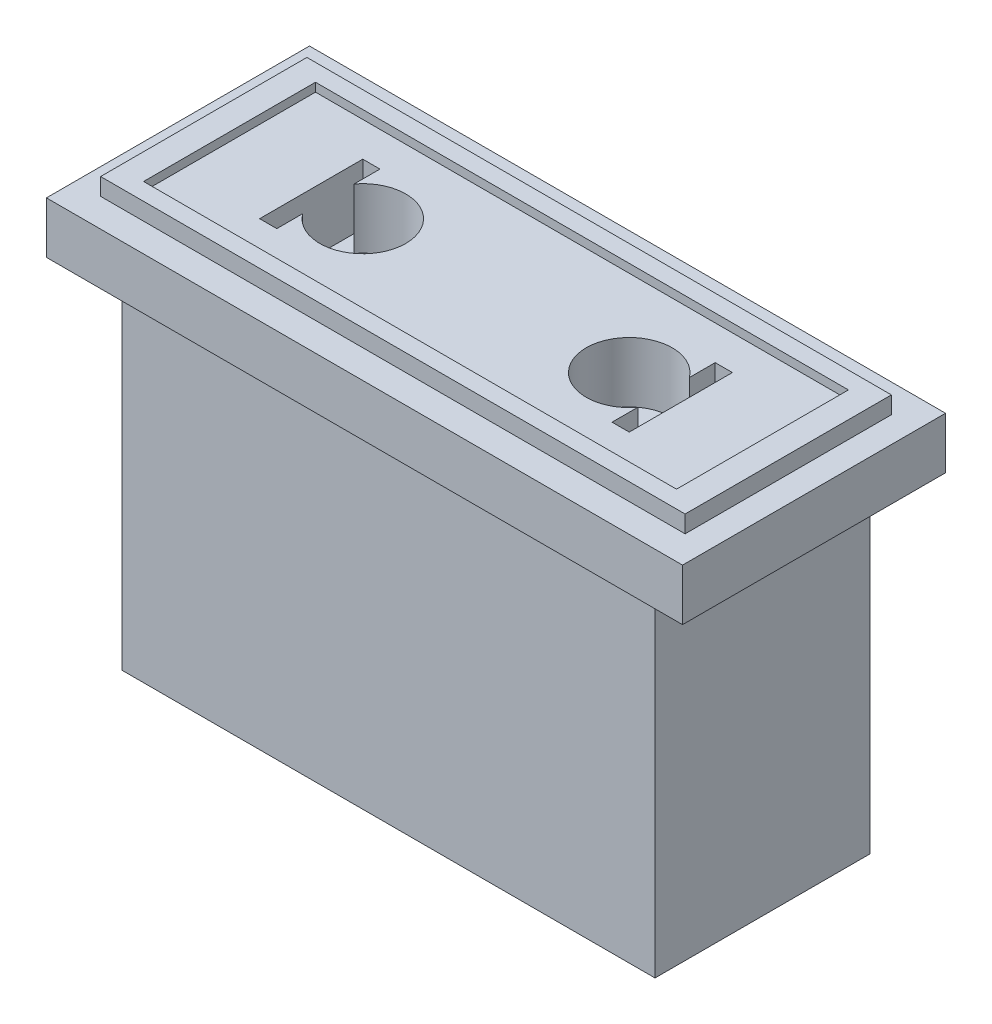
ISO-10303-21;
HEADER;
FILE_DESCRIPTION(('STEP AP214'),'2;1');
FILE_NAME('part.step','',(''),(''),'','','');
FILE_SCHEMA(('AUTOMOTIVE_DESIGN { 1 0 10303 214 1 1 1 1 }'));
ENDSEC;
DATA;
#1=APPLICATION_CONTEXT('core data for automotive mechanical design processes');
#2=APPLICATION_PROTOCOL_DEFINITION('international standard','automotive_design',2000,#1);
#3=PRODUCT_CONTEXT('',#1,'mechanical');
#4=PRODUCT('Part','Part','',(#3));
#5=PRODUCT_RELATED_PRODUCT_CATEGORY('part','',(#4));
#6=PRODUCT_DEFINITION_FORMATION('','',#4);
#7=PRODUCT_DEFINITION_CONTEXT('part definition',#1,'design');
#8=PRODUCT_DEFINITION('design','',#6,#7);
#9=PRODUCT_DEFINITION_SHAPE('','',#8);
#10=(LENGTH_UNIT() NAMED_UNIT(*) SI_UNIT(.MILLI.,.METRE.));
#11=(NAMED_UNIT(*) PLANE_ANGLE_UNIT() SI_UNIT($,.RADIAN.));
#12=(NAMED_UNIT(*) SI_UNIT($,.STERADIAN.) SOLID_ANGLE_UNIT());
#13=UNCERTAINTY_MEASURE_WITH_UNIT(LENGTH_MEASURE(1.E-05),#10,'distance_accuracy_value','');
#14=(GEOMETRIC_REPRESENTATION_CONTEXT(3) GLOBAL_UNCERTAINTY_ASSIGNED_CONTEXT((#13)) GLOBAL_UNIT_ASSIGNED_CONTEXT((#10,
#11,#12)) REPRESENTATION_CONTEXT('',''));
#15=CARTESIAN_POINT('',(0.,0.,0.));
#16=DIRECTION('',(0.,0.,1.));
#17=DIRECTION('',(1.,0.,0.));
#18=AXIS2_PLACEMENT_3D('',#15,#16,#17);
#19=CARTESIAN_POINT('',(0.,0.,0.));
#20=DIRECTION('',(0.,1.,0.));
#21=DIRECTION('',(0.,0.,1.));
#22=AXIS2_PLACEMENT_3D('',#19,#20,#21);
#23=PLANE('',#22);
#24=DIRECTION('',(0.,0.,1.));
#25=VECTOR('',#24,1.);
#26=CARTESIAN_POINT('',(-18.5,0.,7.65));
#27=LINE('',#26,#25);
#28=CARTESIAN_POINT('',(-18.5,0.,-7.65));
#29=VERTEX_POINT('',#28);
#30=CARTESIAN_POINT('',(-18.5,0.,7.65));
#31=VERTEX_POINT('',#30);
#32=EDGE_CURVE('E475',#29,#31,#27,.T.);
#33=ORIENTED_EDGE('',*,*,#32,.F.);
#34=DIRECTION('',(-1.,0.,0.));
#35=VECTOR('',#34,1.);
#36=CARTESIAN_POINT('',(18.5,0.,-7.65));
#37=LINE('',#36,#35);
#38=CARTESIAN_POINT('',(18.5,0.,-7.65));
#39=VERTEX_POINT('',#38);
#40=EDGE_CURVE('E481',#39,#29,#37,.T.);
#41=ORIENTED_EDGE('',*,*,#40,.F.);
#42=DIRECTION('',(0.,0.,-1.));
#43=VECTOR('',#42,1.);
#44=CARTESIAN_POINT('',(18.5,0.,7.65));
#45=LINE('',#44,#43);
#46=CARTESIAN_POINT('',(18.5,0.,7.65));
#47=VERTEX_POINT('',#46);
#48=EDGE_CURVE('E497',#47,#39,#45,.T.);
#49=ORIENTED_EDGE('',*,*,#48,.F.);
#50=DIRECTION('',(1.,0.,0.));
#51=VECTOR('',#50,1.);
#52=CARTESIAN_POINT('',(18.5,0.,7.65));
#53=LINE('',#52,#51);
#54=EDGE_CURVE('E494',#31,#47,#53,.T.);
#55=ORIENTED_EDGE('',*,*,#54,.F.);
#56=EDGE_LOOP('',(#33,#41,#49,#55));
#57=FACE_BOUND('',#56,.T.);
#58=DIRECTION('',(0.,0.,-1.));
#59=VECTOR('',#58,1.);
#60=CARTESIAN_POINT('',(-15.5,0.,-6.25));
#61=LINE('',#60,#59);
#62=CARTESIAN_POINT('',(-15.5,0.,6.25));
#63=VERTEX_POINT('',#62);
#64=CARTESIAN_POINT('',(-15.5,0.,-6.25));
#65=VERTEX_POINT('',#64);
#66=EDGE_CURVE('E55',#63,#65,#61,.T.);
#67=ORIENTED_EDGE('',*,*,#66,.F.);
#68=DIRECTION('',(-1.,0.,0.));
#69=VECTOR('',#68,1.);
#70=CARTESIAN_POINT('',(15.5,0.,6.25));
#71=LINE('',#70,#69);
#72=CARTESIAN_POINT('',(15.5,0.,6.25));
#73=VERTEX_POINT('',#72);
#74=EDGE_CURVE('E59',#73,#63,#71,.T.);
#75=ORIENTED_EDGE('',*,*,#74,.F.);
#76=DIRECTION('',(0.,0.,1.));
#77=VECTOR('',#76,1.);
#78=CARTESIAN_POINT('',(15.5,0.,-6.25));
#79=LINE('',#78,#77);
#80=CARTESIAN_POINT('',(15.5,0.,-6.25));
#81=VERTEX_POINT('',#80);
#82=EDGE_CURVE('E906',#81,#73,#79,.T.);
#83=ORIENTED_EDGE('',*,*,#82,.F.);
#84=DIRECTION('',(1.,0.,0.));
#85=VECTOR('',#84,1.);
#86=CARTESIAN_POINT('',(15.5,0.,-6.25));
#87=LINE('',#86,#85);
#88=EDGE_CURVE('E916',#65,#81,#87,.T.);
#89=ORIENTED_EDGE('',*,*,#88,.F.);
#90=EDGE_LOOP('',(#67,#75,#83,#89));
#91=FACE_BOUND('',#90,.T.);
#92=ADVANCED_FACE('F39',(#57,#91),#23,.F.);
#93=CARTESIAN_POINT('',(-18.5,3.,7.65));
#94=DIRECTION('',(1.,0.,0.));
#95=DIRECTION('',(0.,0.,-1.));
#96=AXIS2_PLACEMENT_3D('',#93,#94,#95);
#97=PLANE('',#96);
#98=ORIENTED_EDGE('',*,*,#32,.T.);
#99=DIRECTION('',(0.,-1.,0.));
#100=VECTOR('',#99,1.);
#101=CARTESIAN_POINT('',(-18.5,3.,7.65));
#102=LINE('',#101,#100);
#103=CARTESIAN_POINT('',(-18.5,3.,7.65));
#104=VERTEX_POINT('',#103);
#105=EDGE_CURVE('E11',#104,#31,#102,.T.);
#106=ORIENTED_EDGE('',*,*,#105,.F.);
#107=DIRECTION('',(0.,0.,1.));
#108=VECTOR('',#107,1.);
#109=CARTESIAN_POINT('',(-18.5,3.,7.65));
#110=LINE('',#109,#108);
#111=CARTESIAN_POINT('',(-18.5,3.,-7.65));
#112=VERTEX_POINT('',#111);
#113=EDGE_CURVE('E476',#112,#104,#110,.T.);
#114=ORIENTED_EDGE('',*,*,#113,.F.);
#115=DIRECTION('',(0.,-1.,0.));
#116=VECTOR('',#115,1.);
#117=CARTESIAN_POINT('',(-18.5,3.,-7.65));
#118=LINE('',#117,#116);
#119=EDGE_CURVE('E490',#112,#29,#118,.T.);
#120=ORIENTED_EDGE('',*,*,#119,.T.);
#121=EDGE_LOOP('',(#98,#106,#114,#120));
#122=FACE_BOUND('',#121,.T.);
#123=ADVANCED_FACE('F41',(#122),#97,.F.);
#124=CARTESIAN_POINT('',(18.5,3.,7.65));
#125=DIRECTION('',(0.,0.,-1.));
#126=DIRECTION('',(-1.,0.,0.));
#127=AXIS2_PLACEMENT_3D('',#124,#125,#126);
#128=PLANE('',#127);
#129=ORIENTED_EDGE('',*,*,#54,.T.);
#130=DIRECTION('',(0.,-1.,0.));
#131=VECTOR('',#130,1.);
#132=CARTESIAN_POINT('',(18.5,3.,7.65));
#133=LINE('',#132,#131);
#134=CARTESIAN_POINT('',(18.5,3.,7.65));
#135=VERTEX_POINT('',#134);
#136=EDGE_CURVE('E48',#135,#47,#133,.T.);
#137=ORIENTED_EDGE('',*,*,#136,.F.);
#138=DIRECTION('',(1.,0.,0.));
#139=VECTOR('',#138,1.);
#140=CARTESIAN_POINT('',(18.5,3.,7.65));
#141=LINE('',#140,#139);
#142=EDGE_CURVE('E480',#104,#135,#141,.T.);
#143=ORIENTED_EDGE('',*,*,#142,.F.);
#144=ORIENTED_EDGE('',*,*,#105,.T.);
#145=EDGE_LOOP('',(#129,#137,#143,#144));
#146=FACE_BOUND('',#145,.T.);
#147=ADVANCED_FACE('F529',(#146),#128,.F.);
#148=CARTESIAN_POINT('',(18.5,3.,7.65));
#149=DIRECTION('',(-1.,0.,0.));
#150=DIRECTION('',(0.,0.,1.));
#151=AXIS2_PLACEMENT_3D('',#148,#149,#150);
#152=PLANE('',#151);
#153=ORIENTED_EDGE('',*,*,#48,.T.);
#154=DIRECTION('',(0.,-1.,0.));
#155=VECTOR('',#154,1.);
#156=CARTESIAN_POINT('',(18.5,3.,-7.65));
#157=LINE('',#156,#155);
#158=CARTESIAN_POINT('',(18.5,3.,-7.65));
#159=VERTEX_POINT('',#158);
#160=EDGE_CURVE('E505',#159,#39,#157,.T.);
#161=ORIENTED_EDGE('',*,*,#160,.F.);
#162=DIRECTION('',(0.,0.,-1.));
#163=VECTOR('',#162,1.);
#164=CARTESIAN_POINT('',(18.5,3.,7.65));
#165=LINE('',#164,#163);
#166=EDGE_CURVE('E484',#135,#159,#165,.T.);
#167=ORIENTED_EDGE('',*,*,#166,.F.);
#168=ORIENTED_EDGE('',*,*,#136,.T.);
#169=EDGE_LOOP('',(#153,#161,#167,#168));
#170=FACE_BOUND('',#169,.T.);
#171=ADVANCED_FACE('F514',(#170),#152,.F.);
#172=CARTESIAN_POINT('',(18.5,3.,-7.65));
#173=DIRECTION('',(0.,0.,1.));
#174=DIRECTION('',(1.,0.,0.));
#175=AXIS2_PLACEMENT_3D('',#172,#173,#174);
#176=PLANE('',#175);
#177=ORIENTED_EDGE('',*,*,#40,.T.);
#178=ORIENTED_EDGE('',*,*,#119,.F.);
#179=DIRECTION('',(-1.,0.,0.));
#180=VECTOR('',#179,1.);
#181=CARTESIAN_POINT('',(18.5,3.,-7.65));
#182=LINE('',#181,#180);
#183=EDGE_CURVE('E487',#159,#112,#182,.T.);
#184=ORIENTED_EDGE('',*,*,#183,.F.);
#185=ORIENTED_EDGE('',*,*,#160,.T.);
#186=EDGE_LOOP('',(#177,#178,#184,#185));
#187=FACE_BOUND('',#186,.T.);
#188=ADVANCED_FACE('F522',(#187),#176,.F.);
#189=CARTESIAN_POINT('',(0.,3.,0.));
#190=DIRECTION('',(0.,1.,0.));
#191=DIRECTION('',(0.,0.,1.));
#192=AXIS2_PLACEMENT_3D('',#189,#190,#191);
#193=PLANE('',#192);
#194=DIRECTION('',(0.,0.,1.));
#195=VECTOR('',#194,1.);
#196=CARTESIAN_POINT('',(-17.,3.,6.));
#197=LINE('',#196,#195);
#198=CARTESIAN_POINT('',(-17.,3.,-6.));
#199=VERTEX_POINT('',#198);
#200=CARTESIAN_POINT('',(-17.,3.,6.));
#201=VERTEX_POINT('',#200);
#202=EDGE_CURVE('E421',#199,#201,#197,.T.);
#203=ORIENTED_EDGE('',*,*,#202,.F.);
#204=DIRECTION('',(-1.,0.,0.));
#205=VECTOR('',#204,1.);
#206=CARTESIAN_POINT('',(17.,3.,-6.));
#207=LINE('',#206,#205);
#208=CARTESIAN_POINT('',(17.,3.,-6.));
#209=VERTEX_POINT('',#208);
#210=EDGE_CURVE('E436',#209,#199,#207,.T.);
#211=ORIENTED_EDGE('',*,*,#210,.F.);
#212=DIRECTION('',(0.,0.,-1.));
#213=VECTOR('',#212,1.);
#214=CARTESIAN_POINT('',(17.,3.,6.));
#215=LINE('',#214,#213);
#216=CARTESIAN_POINT('',(17.,3.,6.));
#217=VERTEX_POINT('',#216);
#218=EDGE_CURVE('E453',#217,#209,#215,.T.);
#219=ORIENTED_EDGE('',*,*,#218,.F.);
#220=DIRECTION('',(1.,0.,0.));
#221=VECTOR('',#220,1.);
#222=CARTESIAN_POINT('',(17.,3.,6.));
#223=LINE('',#222,#221);
#224=EDGE_CURVE('E449',#201,#217,#223,.T.);
#225=ORIENTED_EDGE('',*,*,#224,.F.);
#226=EDGE_LOOP('',(#203,#211,#219,#225));
#227=FACE_BOUND('',#226,.T.);
#228=ORIENTED_EDGE('',*,*,#113,.T.);
#229=ORIENTED_EDGE('',*,*,#142,.T.);
#230=ORIENTED_EDGE('',*,*,#166,.T.);
#231=ORIENTED_EDGE('',*,*,#183,.T.);
#232=EDGE_LOOP('',(#228,#229,#230,#231));
#233=FACE_BOUND('',#232,.T.);
#234=ADVANCED_FACE('F528',(#227,#233),#193,.T.);
#235=CARTESIAN_POINT('',(-17.,4.,6.));
#236=DIRECTION('',(1.,0.,0.));
#237=DIRECTION('',(0.,0.,-1.));
#238=AXIS2_PLACEMENT_3D('',#235,#236,#237);
#239=PLANE('',#238);
#240=ORIENTED_EDGE('',*,*,#202,.T.);
#241=DIRECTION('',(0.,-1.,0.));
#242=VECTOR('',#241,1.);
#243=CARTESIAN_POINT('',(-17.,4.,6.));
#244=LINE('',#243,#242);
#245=CARTESIAN_POINT('',(-17.,4.,6.));
#246=VERTEX_POINT('',#245);
#247=EDGE_CURVE('E471',#246,#201,#244,.T.);
#248=ORIENTED_EDGE('',*,*,#247,.F.);
#249=DIRECTION('',(0.,0.,1.));
#250=VECTOR('',#249,1.);
#251=CARTESIAN_POINT('',(-17.,4.,6.));
#252=LINE('',#251,#250);
#253=CARTESIAN_POINT('',(-17.,4.,-6.));
#254=VERTEX_POINT('',#253);
#255=EDGE_CURVE('E431',#254,#246,#252,.T.);
#256=ORIENTED_EDGE('',*,*,#255,.F.);
#257=DIRECTION('',(0.,-1.,0.));
#258=VECTOR('',#257,1.);
#259=CARTESIAN_POINT('',(-17.,4.,-6.));
#260=LINE('',#259,#258);
#261=EDGE_CURVE('E445',#254,#199,#260,.T.);
#262=ORIENTED_EDGE('',*,*,#261,.T.);
#263=EDGE_LOOP('',(#240,#248,#256,#262));
#264=FACE_BOUND('',#263,.T.);
#265=ADVANCED_FACE('F547',(#264),#239,.F.);
#266=CARTESIAN_POINT('',(17.,4.,6.));
#267=DIRECTION('',(0.,0.,-1.));
#268=DIRECTION('',(-1.,0.,0.));
#269=AXIS2_PLACEMENT_3D('',#266,#267,#268);
#270=PLANE('',#269);
#271=ORIENTED_EDGE('',*,*,#224,.T.);
#272=DIRECTION('',(0.,-1.,0.));
#273=VECTOR('',#272,1.);
#274=CARTESIAN_POINT('',(17.,4.,6.));
#275=LINE('',#274,#273);
#276=CARTESIAN_POINT('',(17.,4.,6.));
#277=VERTEX_POINT('',#276);
#278=EDGE_CURVE('E467',#277,#217,#275,.T.);
#279=ORIENTED_EDGE('',*,*,#278,.F.);
#280=DIRECTION('',(1.,0.,0.));
#281=VECTOR('',#280,1.);
#282=CARTESIAN_POINT('',(17.,4.,6.));
#283=LINE('',#282,#281);
#284=EDGE_CURVE('E435',#246,#277,#283,.T.);
#285=ORIENTED_EDGE('',*,*,#284,.F.);
#286=ORIENTED_EDGE('',*,*,#247,.T.);
#287=EDGE_LOOP('',(#271,#279,#285,#286));
#288=FACE_BOUND('',#287,.T.);
#289=ADVANCED_FACE('F552',(#288),#270,.F.);
#290=CARTESIAN_POINT('',(17.,4.,6.));
#291=DIRECTION('',(-1.,0.,0.));
#292=DIRECTION('',(0.,0.,1.));
#293=AXIS2_PLACEMENT_3D('',#290,#291,#292);
#294=PLANE('',#293);
#295=ORIENTED_EDGE('',*,*,#218,.T.);
#296=DIRECTION('',(0.,-1.,0.));
#297=VECTOR('',#296,1.);
#298=CARTESIAN_POINT('',(17.,4.,-6.));
#299=LINE('',#298,#297);
#300=CARTESIAN_POINT('',(17.,4.,-6.));
#301=VERTEX_POINT('',#300);
#302=EDGE_CURVE('E463',#301,#209,#299,.T.);
#303=ORIENTED_EDGE('',*,*,#302,.F.);
#304=DIRECTION('',(0.,0.,-1.));
#305=VECTOR('',#304,1.);
#306=CARTESIAN_POINT('',(17.,4.,6.));
#307=LINE('',#306,#305);
#308=EDGE_CURVE('E439',#277,#301,#307,.T.);
#309=ORIENTED_EDGE('',*,*,#308,.F.);
#310=ORIENTED_EDGE('',*,*,#278,.T.);
#311=EDGE_LOOP('',(#295,#303,#309,#310));
#312=FACE_BOUND('',#311,.T.);
#313=ADVANCED_FACE('F566',(#312),#294,.F.);
#314=CARTESIAN_POINT('',(17.,4.,-6.));
#315=DIRECTION('',(0.,0.,1.));
#316=DIRECTION('',(1.,0.,0.));
#317=AXIS2_PLACEMENT_3D('',#314,#315,#316);
#318=PLANE('',#317);
#319=ORIENTED_EDGE('',*,*,#210,.T.);
#320=ORIENTED_EDGE('',*,*,#261,.F.);
#321=DIRECTION('',(-1.,0.,0.));
#322=VECTOR('',#321,1.);
#323=CARTESIAN_POINT('',(17.,4.,-6.));
#324=LINE('',#323,#322);
#325=EDGE_CURVE('E442',#301,#254,#324,.T.);
#326=ORIENTED_EDGE('',*,*,#325,.F.);
#327=ORIENTED_EDGE('',*,*,#302,.T.);
#328=EDGE_LOOP('',(#319,#320,#326,#327));
#329=FACE_BOUND('',#328,.T.);
#330=ADVANCED_FACE('F557',(#329),#318,.F.);
#331=CARTESIAN_POINT('',(0.,4.,0.));
#332=DIRECTION('',(0.,1.,0.));
#333=DIRECTION('',(0.,0.,1.));
#334=AXIS2_PLACEMENT_3D('',#331,#332,#333);
#335=PLANE('',#334);
#336=DIRECTION('',(0.,0.,1.));
#337=VECTOR('',#336,1.);
#338=CARTESIAN_POINT('',(-15.5,4.,5.));
#339=LINE('',#338,#337);
#340=CARTESIAN_POINT('',(-15.5,4.,-5.));
#341=VERTEX_POINT('',#340);
#342=CARTESIAN_POINT('',(-15.5,4.,5.));
#343=VERTEX_POINT('',#342);
#344=EDGE_CURVE('E386',#341,#343,#339,.T.);
#345=ORIENTED_EDGE('',*,*,#344,.F.);
#346=DIRECTION('',(-1.,0.,0.));
#347=VECTOR('',#346,1.);
#348=CARTESIAN_POINT('',(15.5,4.,-5.));
#349=LINE('',#348,#347);
#350=CARTESIAN_POINT('',(15.5,4.,-5.));
#351=VERTEX_POINT('',#350);
#352=EDGE_CURVE('E392',#351,#341,#349,.T.);
#353=ORIENTED_EDGE('',*,*,#352,.F.);
#354=DIRECTION('',(0.,0.,-1.));
#355=VECTOR('',#354,1.);
#356=CARTESIAN_POINT('',(15.5,4.,5.));
#357=LINE('',#356,#355);
#358=CARTESIAN_POINT('',(15.5,4.,5.));
#359=VERTEX_POINT('',#358);
#360=EDGE_CURVE('E411',#359,#351,#357,.T.);
#361=ORIENTED_EDGE('',*,*,#360,.F.);
#362=DIRECTION('',(1.,0.,0.));
#363=VECTOR('',#362,1.);
#364=CARTESIAN_POINT('',(15.5,4.,5.));
#365=LINE('',#364,#363);
#366=EDGE_CURVE('E407',#343,#359,#365,.T.);
#367=ORIENTED_EDGE('',*,*,#366,.F.);
#368=EDGE_LOOP('',(#345,#353,#361,#367));
#369=FACE_BOUND('',#368,.T.);
#370=ORIENTED_EDGE('',*,*,#255,.T.);
#371=ORIENTED_EDGE('',*,*,#284,.T.);
#372=ORIENTED_EDGE('',*,*,#308,.T.);
#373=ORIENTED_EDGE('',*,*,#325,.T.);
#374=EDGE_LOOP('',(#370,#371,#372,#373));
#375=FACE_BOUND('',#374,.T.);
#376=ADVANCED_FACE('F562',(#369,#375),#335,.T.);
#377=CARTESIAN_POINT('',(-15.5,3.5,5.));
#378=DIRECTION('',(-1.,0.,0.));
#379=DIRECTION('',(0.,0.,1.));
#380=AXIS2_PLACEMENT_3D('',#377,#378,#379);
#381=PLANE('',#380);
#382=ORIENTED_EDGE('',*,*,#344,.T.);
#383=DIRECTION('',(0.,1.,0.));
#384=VECTOR('',#383,1.);
#385=CARTESIAN_POINT('',(-15.5,3.5,5.));
#386=LINE('',#385,#384);
#387=CARTESIAN_POINT('',(-15.5,3.5,5.));
#388=VERTEX_POINT('',#387);
#389=EDGE_CURVE('E404',#388,#343,#386,.T.);
#390=ORIENTED_EDGE('',*,*,#389,.F.);
#391=DIRECTION('',(0.,0.,1.));
#392=VECTOR('',#391,1.);
#393=CARTESIAN_POINT('',(-15.5,3.5,5.));
#394=LINE('',#393,#392);
#395=CARTESIAN_POINT('',(-15.5,3.5,-5.));
#396=VERTEX_POINT('',#395);
#397=EDGE_CURVE('E387',#396,#388,#394,.T.);
#398=ORIENTED_EDGE('',*,*,#397,.F.);
#399=DIRECTION('',(0.,1.,0.));
#400=VECTOR('',#399,1.);
#401=CARTESIAN_POINT('',(-15.5,3.5,-5.));
#402=LINE('',#401,#400);
#403=EDGE_CURVE('E418',#396,#341,#402,.T.);
#404=ORIENTED_EDGE('',*,*,#403,.T.);
#405=EDGE_LOOP('',(#382,#390,#398,#404));
#406=FACE_BOUND('',#405,.T.);
#407=ADVANCED_FACE('F579',(#406),#381,.F.);
#408=CARTESIAN_POINT('',(15.5,3.5,-5.));
#409=DIRECTION('',(0.,0.,-1.));
#410=DIRECTION('',(-1.,0.,0.));
#411=AXIS2_PLACEMENT_3D('',#408,#409,#410);
#412=PLANE('',#411);
#413=ORIENTED_EDGE('',*,*,#352,.T.);
#414=ORIENTED_EDGE('',*,*,#403,.F.);
#415=DIRECTION('',(-1.,0.,0.));
#416=VECTOR('',#415,1.);
#417=CARTESIAN_POINT('',(15.5,3.5,-5.));
#418=LINE('',#417,#416);
#419=CARTESIAN_POINT('',(15.5,3.5,-5.));
#420=VERTEX_POINT('',#419);
#421=EDGE_CURVE('E400',#420,#396,#418,.T.);
#422=ORIENTED_EDGE('',*,*,#421,.F.);
#423=DIRECTION('',(0.,1.,0.));
#424=VECTOR('',#423,1.);
#425=CARTESIAN_POINT('',(15.5,3.5,-5.));
#426=LINE('',#425,#424);
#427=EDGE_CURVE('E422',#420,#351,#426,.T.);
#428=ORIENTED_EDGE('',*,*,#427,.T.);
#429=EDGE_LOOP('',(#413,#414,#422,#428));
#430=FACE_BOUND('',#429,.T.);
#431=ADVANCED_FACE('F583',(#430),#412,.F.);
#432=CARTESIAN_POINT('',(15.5,3.5,5.));
#433=DIRECTION('',(1.,0.,0.));
#434=DIRECTION('',(0.,0.,-1.));
#435=AXIS2_PLACEMENT_3D('',#432,#433,#434);
#436=PLANE('',#435);
#437=ORIENTED_EDGE('',*,*,#360,.T.);
#438=ORIENTED_EDGE('',*,*,#427,.F.);
#439=DIRECTION('',(0.,0.,-1.));
#440=VECTOR('',#439,1.);
#441=CARTESIAN_POINT('',(15.5,3.5,5.));
#442=LINE('',#441,#440);
#443=CARTESIAN_POINT('',(15.5,3.5,5.));
#444=VERTEX_POINT('',#443);
#445=EDGE_CURVE('E396',#444,#420,#442,.T.);
#446=ORIENTED_EDGE('',*,*,#445,.F.);
#447=DIRECTION('',(0.,1.,0.));
#448=VECTOR('',#447,1.);
#449=CARTESIAN_POINT('',(15.5,3.5,5.));
#450=LINE('',#449,#448);
#451=EDGE_CURVE('E425',#444,#359,#450,.T.);
#452=ORIENTED_EDGE('',*,*,#451,.T.);
#453=EDGE_LOOP('',(#437,#438,#446,#452));
#454=FACE_BOUND('',#453,.T.);
#455=ADVANCED_FACE('F589',(#454),#436,.F.);
#456=CARTESIAN_POINT('',(15.5,3.5,5.));
#457=DIRECTION('',(0.,0.,1.));
#458=DIRECTION('',(1.,0.,0.));
#459=AXIS2_PLACEMENT_3D('',#456,#457,#458);
#460=PLANE('',#459);
#461=ORIENTED_EDGE('',*,*,#366,.T.);
#462=ORIENTED_EDGE('',*,*,#451,.F.);
#463=DIRECTION('',(1.,0.,0.));
#464=VECTOR('',#463,1.);
#465=CARTESIAN_POINT('',(15.5,3.5,5.));
#466=LINE('',#465,#464);
#467=EDGE_CURVE('E391',#388,#444,#466,.T.);
#468=ORIENTED_EDGE('',*,*,#467,.F.);
#469=ORIENTED_EDGE('',*,*,#389,.T.);
#470=EDGE_LOOP('',(#461,#462,#468,#469));
#471=FACE_BOUND('',#470,.T.);
#472=ADVANCED_FACE('F585',(#471),#460,.F.);
#473=CARTESIAN_POINT('',(0.,3.5,0.));
#474=DIRECTION('',(0.,1.,0.));
#475=DIRECTION('',(0.,0.,1.));
#476=AXIS2_PLACEMENT_3D('',#473,#474,#475);
#477=PLANE('',#476);
#478=DIRECTION('',(0.,0.,-1.));
#479=VECTOR('',#478,1.);
#480=CARTESIAN_POINT('',(-9.75,3.5,1.5));
#481=LINE('',#480,#479);
#482=CARTESIAN_POINT('',(-9.75,3.5,3.));
#483=VERTEX_POINT('',#482);
#484=CARTESIAN_POINT('',(-9.75,3.5,1.5));
#485=VERTEX_POINT('',#484);
#486=EDGE_CURVE('E258',#483,#485,#481,.T.);
#487=ORIENTED_EDGE('',*,*,#486,.F.);
#488=DIRECTION('',(1.,0.,0.));
#489=VECTOR('',#488,1.);
#490=CARTESIAN_POINT('',(-10.75,3.5,3.));
#491=LINE('',#490,#489);
#492=CARTESIAN_POINT('',(-10.75,3.5,3.));
#493=VERTEX_POINT('',#492);
#494=EDGE_CURVE('E278',#493,#483,#491,.T.);
#495=ORIENTED_EDGE('',*,*,#494,.F.);
#496=DIRECTION('',(0.,0.,1.));
#497=VECTOR('',#496,1.);
#498=CARTESIAN_POINT('',(-10.75,3.5,-3.));
#499=LINE('',#498,#497);
#500=CARTESIAN_POINT('',(-10.75,3.5,-3.));
#501=VERTEX_POINT('',#500);
#502=EDGE_CURVE('E274',#501,#493,#499,.T.);
#503=ORIENTED_EDGE('',*,*,#502,.F.);
#504=DIRECTION('',(-1.,0.,0.));
#505=VECTOR('',#504,1.);
#506=CARTESIAN_POINT('',(-10.75,3.5,-3.));
#507=LINE('',#506,#505);
#508=CARTESIAN_POINT('',(-9.75,3.5,-3.));
#509=VERTEX_POINT('',#508);
#510=EDGE_CURVE('E270',#509,#501,#507,.T.);
#511=ORIENTED_EDGE('',*,*,#510,.F.);
#512=DIRECTION('',(0.,0.,-1.));
#513=VECTOR('',#512,1.);
#514=CARTESIAN_POINT('',(-9.75,3.5,-3.));
#515=LINE('',#514,#513);
#516=CARTESIAN_POINT('',(-9.75,3.5,-1.5));
#517=VERTEX_POINT('',#516);
#518=EDGE_CURVE('E266',#517,#509,#515,.T.);
#519=ORIENTED_EDGE('',*,*,#518,.F.);
#520=CARTESIAN_POINT('',(-7.75,3.5,0.));
#521=DIRECTION('',(0.,1.,0.));
#522=DIRECTION('',(0.,0.,1.));
#523=AXIS2_PLACEMENT_3D('',#520,#521,#522);
#524=CIRCLE('',#523,2.5);
#525=EDGE_CURVE('E261',#485,#517,#524,.T.);
#526=ORIENTED_EDGE('',*,*,#525,.F.);
#527=EDGE_LOOP('',(#487,#495,#503,#511,#519,#526));
#528=FACE_BOUND('',#527,.T.);
#529=CARTESIAN_POINT('',(7.75,3.5,0.));
#530=DIRECTION('',(0.,1.,0.));
#531=DIRECTION('',(0.,0.,-1.));
#532=AXIS2_PLACEMENT_3D('',#529,#530,#531);
#533=CIRCLE('',#532,2.5);
#534=CARTESIAN_POINT('',(9.75000000000001,3.5,-1.5));
#535=VERTEX_POINT('',#534);
#536=CARTESIAN_POINT('',(9.75000000000001,3.5,1.5));
#537=VERTEX_POINT('',#536);
#538=EDGE_CURVE('E248',#535,#537,#533,.T.);
#539=ORIENTED_EDGE('',*,*,#538,.F.);
#540=DIRECTION('',(0.,0.,1.));
#541=VECTOR('',#540,1.);
#542=CARTESIAN_POINT('',(9.75000000000001,3.5,-3.));
#543=LINE('',#542,#541);
#544=CARTESIAN_POINT('',(9.75000000000001,3.5,-3.));
#545=VERTEX_POINT('',#544);
#546=EDGE_CURVE('E317',#545,#535,#543,.T.);
#547=ORIENTED_EDGE('',*,*,#546,.F.);
#548=DIRECTION('',(-1.,0.,0.));
#549=VECTOR('',#548,1.);
#550=CARTESIAN_POINT('',(10.75,3.5,-3.));
#551=LINE('',#550,#549);
#552=CARTESIAN_POINT('',(10.75,3.5,-3.));
#553=VERTEX_POINT('',#552);
#554=EDGE_CURVE('E313',#553,#545,#551,.T.);
#555=ORIENTED_EDGE('',*,*,#554,.F.);
#556=DIRECTION('',(0.,0.,-1.));
#557=VECTOR('',#556,1.);
#558=CARTESIAN_POINT('',(10.75,3.5,-3.));
#559=LINE('',#558,#557);
#560=CARTESIAN_POINT('',(10.75,3.5,3.));
#561=VERTEX_POINT('',#560);
#562=EDGE_CURVE('E309',#561,#553,#559,.T.);
#563=ORIENTED_EDGE('',*,*,#562,.F.);
#564=DIRECTION('',(1.,0.,0.));
#565=VECTOR('',#564,1.);
#566=CARTESIAN_POINT('',(10.75,3.5,3.));
#567=LINE('',#566,#565);
#568=CARTESIAN_POINT('',(9.75000000000001,3.5,3.));
#569=VERTEX_POINT('',#568);
#570=EDGE_CURVE('E305',#569,#561,#567,.T.);
#571=ORIENTED_EDGE('',*,*,#570,.F.);
#572=DIRECTION('',(0.,0.,1.));
#573=VECTOR('',#572,1.);
#574=CARTESIAN_POINT('',(9.75000000000001,3.5,1.5));
#575=LINE('',#574,#573);
#576=EDGE_CURVE('E252',#537,#569,#575,.T.);
#577=ORIENTED_EDGE('',*,*,#576,.F.);
#578=EDGE_LOOP('',(#539,#547,#555,#563,#571,#577));
#579=FACE_BOUND('',#578,.T.);
#580=ORIENTED_EDGE('',*,*,#397,.T.);
#581=ORIENTED_EDGE('',*,*,#467,.T.);
#582=ORIENTED_EDGE('',*,*,#445,.T.);
#583=ORIENTED_EDGE('',*,*,#421,.T.);
#584=EDGE_LOOP('',(#580,#581,#582,#583));
#585=FACE_BOUND('',#584,.T.);
#586=ADVANCED_FACE('F588',(#528,#579,#585),#477,.T.);
#587=CARTESIAN_POINT('',(7.75,-1.5,0.));
#588=DIRECTION('',(0.,1.,0.));
#589=DIRECTION('',(0.,0.,1.));
#590=AXIS2_PLACEMENT_3D('',#587,#588,#589);
#591=CYLINDRICAL_SURFACE('',#590,2.5);
#592=DIRECTION('',(0.,1.,0.));
#593=VECTOR('',#592,1.);
#594=CARTESIAN_POINT('',(9.75000000000001,-1.5,-1.5));
#595=LINE('',#594,#593);
#596=CARTESIAN_POINT('',(9.75000000000001,0.,-1.5));
#597=VERTEX_POINT('',#596);
#598=EDGE_CURVE('E262',#597,#535,#595,.T.);
#599=ORIENTED_EDGE('',*,*,#598,.T.);
#600=ORIENTED_EDGE('',*,*,#538,.T.);
#601=DIRECTION('',(0.,1.,0.));
#602=VECTOR('',#601,1.);
#603=CARTESIAN_POINT('',(9.75000000000001,-1.5,1.5));
#604=LINE('',#603,#602);
#605=CARTESIAN_POINT('',(9.75000000000001,0.,1.5));
#606=VERTEX_POINT('',#605);
#607=EDGE_CURVE('E321',#606,#537,#604,.T.);
#608=ORIENTED_EDGE('',*,*,#607,.F.);
#609=CARTESIAN_POINT('',(7.75,0.,0.));
#610=DIRECTION('',(0.,1.,0.));
#611=DIRECTION('',(0.,0.,1.));
#612=AXIS2_PLACEMENT_3D('',#609,#610,#611);
#613=CIRCLE('',#612,2.5);
#614=EDGE_CURVE('E358',#597,#606,#613,.T.);
#615=ORIENTED_EDGE('',*,*,#614,.F.);
#616=EDGE_LOOP('',(#599,#600,#608,#615));
#617=FACE_BOUND('',#616,.T.);
#618=ADVANCED_FACE('F599',(#617),#591,.F.);
#619=CARTESIAN_POINT('',(9.75000000000001,-1.5,-3.));
#620=DIRECTION('',(-1.,0.,0.));
#621=DIRECTION('',(0.,0.,1.));
#622=AXIS2_PLACEMENT_3D('',#619,#620,#621);
#623=PLANE('',#622);
#624=DIRECTION('',(0.,1.,0.));
#625=VECTOR('',#624,1.);
#626=CARTESIAN_POINT('',(9.75000000000001,-1.5,-3.));
#627=LINE('',#626,#625);
#628=CARTESIAN_POINT('',(9.75000000000001,0.,-3.));
#629=VERTEX_POINT('',#628);
#630=EDGE_CURVE('E324',#629,#545,#627,.T.);
#631=ORIENTED_EDGE('',*,*,#630,.T.);
#632=ORIENTED_EDGE('',*,*,#546,.T.);
#633=ORIENTED_EDGE('',*,*,#598,.F.);
#634=DIRECTION('',(0.,0.,1.));
#635=VECTOR('',#634,1.);
#636=CARTESIAN_POINT('',(9.75000000000001,0.,0.));
#637=LINE('',#636,#635);
#638=EDGE_CURVE('E354',#629,#597,#637,.T.);
#639=ORIENTED_EDGE('',*,*,#638,.F.);
#640=EDGE_LOOP('',(#631,#632,#633,#639));
#641=FACE_BOUND('',#640,.T.);
#642=ADVANCED_FACE('F603',(#641),#623,.F.);
#643=CARTESIAN_POINT('',(10.75,-1.5,-3.));
#644=DIRECTION('',(0.,0.,-1.));
#645=DIRECTION('',(-1.,0.,0.));
#646=AXIS2_PLACEMENT_3D('',#643,#644,#645);
#647=PLANE('',#646);
#648=DIRECTION('',(0.,1.,0.));
#649=VECTOR('',#648,1.);
#650=CARTESIAN_POINT('',(10.75,-1.5,-3.));
#651=LINE('',#650,#649);
#652=CARTESIAN_POINT('',(10.75,0.,-3.));
#653=VERTEX_POINT('',#652);
#654=EDGE_CURVE('E327',#653,#553,#651,.T.);
#655=ORIENTED_EDGE('',*,*,#654,.T.);
#656=ORIENTED_EDGE('',*,*,#554,.T.);
#657=ORIENTED_EDGE('',*,*,#630,.F.);
#658=DIRECTION('',(-1.,0.,0.));
#659=VECTOR('',#658,1.);
#660=CARTESIAN_POINT('',(0.,0.,-3.));
#661=LINE('',#660,#659);
#662=EDGE_CURVE('E350',#653,#629,#661,.T.);
#663=ORIENTED_EDGE('',*,*,#662,.F.);
#664=EDGE_LOOP('',(#655,#656,#657,#663));
#665=FACE_BOUND('',#664,.T.);
#666=ADVANCED_FACE('F617',(#665),#647,.F.);
#667=CARTESIAN_POINT('',(10.75,-1.5,-3.));
#668=DIRECTION('',(1.,0.,0.));
#669=DIRECTION('',(0.,0.,-1.));
#670=AXIS2_PLACEMENT_3D('',#667,#668,#669);
#671=PLANE('',#670);
#672=DIRECTION('',(0.,1.,0.));
#673=VECTOR('',#672,1.);
#674=CARTESIAN_POINT('',(10.75,-1.5,3.));
#675=LINE('',#674,#673);
#676=CARTESIAN_POINT('',(10.75,0.,3.));
#677=VERTEX_POINT('',#676);
#678=EDGE_CURVE('E330',#677,#561,#675,.T.);
#679=ORIENTED_EDGE('',*,*,#678,.T.);
#680=ORIENTED_EDGE('',*,*,#562,.T.);
#681=ORIENTED_EDGE('',*,*,#654,.F.);
#682=DIRECTION('',(0.,0.,-1.));
#683=VECTOR('',#682,1.);
#684=CARTESIAN_POINT('',(10.75,0.,0.));
#685=LINE('',#684,#683);
#686=EDGE_CURVE('E346',#677,#653,#685,.T.);
#687=ORIENTED_EDGE('',*,*,#686,.F.);
#688=EDGE_LOOP('',(#679,#680,#681,#687));
#689=FACE_BOUND('',#688,.T.);
#690=ADVANCED_FACE('F613',(#689),#671,.F.);
#691=CARTESIAN_POINT('',(10.75,-1.5,3.));
#692=DIRECTION('',(0.,0.,1.));
#693=DIRECTION('',(1.,0.,0.));
#694=AXIS2_PLACEMENT_3D('',#691,#692,#693);
#695=PLANE('',#694);
#696=DIRECTION('',(0.,1.,0.));
#697=VECTOR('',#696,1.);
#698=CARTESIAN_POINT('',(9.75000000000001,-1.5,3.));
#699=LINE('',#698,#697);
#700=CARTESIAN_POINT('',(9.75000000000001,0.,3.));
#701=VERTEX_POINT('',#700);
#702=EDGE_CURVE('E333',#701,#569,#699,.T.);
#703=ORIENTED_EDGE('',*,*,#702,.T.);
#704=ORIENTED_EDGE('',*,*,#570,.T.);
#705=ORIENTED_EDGE('',*,*,#678,.F.);
#706=DIRECTION('',(1.,0.,0.));
#707=VECTOR('',#706,1.);
#708=CARTESIAN_POINT('',(0.,0.,3.));
#709=LINE('',#708,#707);
#710=EDGE_CURVE('E342',#701,#677,#709,.T.);
#711=ORIENTED_EDGE('',*,*,#710,.F.);
#712=EDGE_LOOP('',(#703,#704,#705,#711));
#713=FACE_BOUND('',#712,.T.);
#714=ADVANCED_FACE('F609',(#713),#695,.F.);
#715=CARTESIAN_POINT('',(9.75000000000001,-1.5,1.5));
#716=DIRECTION('',(-1.,0.,0.));
#717=DIRECTION('',(0.,0.,1.));
#718=AXIS2_PLACEMENT_3D('',#715,#716,#717);
#719=PLANE('',#718);
#720=ORIENTED_EDGE('',*,*,#607,.T.);
#721=ORIENTED_EDGE('',*,*,#576,.T.);
#722=ORIENTED_EDGE('',*,*,#702,.F.);
#723=DIRECTION('',(0.,0.,1.));
#724=VECTOR('',#723,1.);
#725=CARTESIAN_POINT('',(9.75000000000001,0.,0.));
#726=LINE('',#725,#724);
#727=EDGE_CURVE('E286',#606,#701,#726,.T.);
#728=ORIENTED_EDGE('',*,*,#727,.F.);
#729=EDGE_LOOP('',(#720,#721,#722,#728));
#730=FACE_BOUND('',#729,.T.);
#731=ADVANCED_FACE('F605',(#730),#719,.F.);
#732=CARTESIAN_POINT('',(-9.75,-1.5,1.5));
#733=DIRECTION('',(1.,0.,0.));
#734=DIRECTION('',(0.,0.,-1.));
#735=AXIS2_PLACEMENT_3D('',#732,#733,#734);
#736=PLANE('',#735);
#737=DIRECTION('',(0.,1.,0.));
#738=VECTOR('',#737,1.);
#739=CARTESIAN_POINT('',(-9.75,-1.5,3.));
#740=LINE('',#739,#738);
#741=CARTESIAN_POINT('',(-9.75,0.,3.));
#742=VERTEX_POINT('',#741);
#743=EDGE_CURVE('E283',#742,#483,#740,.T.);
#744=ORIENTED_EDGE('',*,*,#743,.T.);
#745=ORIENTED_EDGE('',*,*,#486,.T.);
#746=DIRECTION('',(0.,1.,0.));
#747=VECTOR('',#746,1.);
#748=CARTESIAN_POINT('',(-9.75,-1.5,1.5));
#749=LINE('',#748,#747);
#750=CARTESIAN_POINT('',(-9.75,0.,1.5));
#751=VERTEX_POINT('',#750);
#752=EDGE_CURVE('E282',#751,#485,#749,.T.);
#753=ORIENTED_EDGE('',*,*,#752,.F.);
#754=DIRECTION('',(0.,0.,-1.));
#755=VECTOR('',#754,1.);
#756=CARTESIAN_POINT('',(-9.75,0.,0.));
#757=LINE('',#756,#755);
#758=EDGE_CURVE('E382',#742,#751,#757,.T.);
#759=ORIENTED_EDGE('',*,*,#758,.F.);
#760=EDGE_LOOP('',(#744,#745,#753,#759));
#761=FACE_BOUND('',#760,.T.);
#762=ADVANCED_FACE('F608',(#761),#736,.F.);
#763=CARTESIAN_POINT('',(-10.75,-1.5,3.));
#764=DIRECTION('',(0.,0.,1.));
#765=DIRECTION('',(1.,0.,0.));
#766=AXIS2_PLACEMENT_3D('',#763,#764,#765);
#767=PLANE('',#766);
#768=DIRECTION('',(0.,1.,0.));
#769=VECTOR('',#768,1.);
#770=CARTESIAN_POINT('',(-10.75,-1.5,3.));
#771=LINE('',#770,#769);
#772=CARTESIAN_POINT('',(-10.75,0.,3.));
#773=VERTEX_POINT('',#772);
#774=EDGE_CURVE('E287',#773,#493,#771,.T.);
#775=ORIENTED_EDGE('',*,*,#774,.T.);
#776=ORIENTED_EDGE('',*,*,#494,.T.);
#777=ORIENTED_EDGE('',*,*,#743,.F.);
#778=DIRECTION('',(1.,0.,0.));
#779=VECTOR('',#778,1.);
#780=CARTESIAN_POINT('',(0.,0.,3.));
#781=LINE('',#780,#779);
#782=EDGE_CURVE('E378',#773,#742,#781,.T.);
#783=ORIENTED_EDGE('',*,*,#782,.F.);
#784=EDGE_LOOP('',(#775,#776,#777,#783));
#785=FACE_BOUND('',#784,.T.);
#786=ADVANCED_FACE('F627',(#785),#767,.F.);
#787=CARTESIAN_POINT('',(-10.75,-1.5,-3.));
#788=DIRECTION('',(-1.,0.,0.));
#789=DIRECTION('',(0.,0.,1.));
#790=AXIS2_PLACEMENT_3D('',#787,#788,#789);
#791=PLANE('',#790);
#792=DIRECTION('',(0.,1.,0.));
#793=VECTOR('',#792,1.);
#794=CARTESIAN_POINT('',(-10.75,-1.5,-3.));
#795=LINE('',#794,#793);
#796=CARTESIAN_POINT('',(-10.75,0.,-3.));
#797=VERTEX_POINT('',#796);
#798=EDGE_CURVE('E290',#797,#501,#795,.T.);
#799=ORIENTED_EDGE('',*,*,#798,.T.);
#800=ORIENTED_EDGE('',*,*,#502,.T.);
#801=ORIENTED_EDGE('',*,*,#774,.F.);
#802=DIRECTION('',(0.,0.,1.));
#803=VECTOR('',#802,1.);
#804=CARTESIAN_POINT('',(-10.75,0.,0.));
#805=LINE('',#804,#803);
#806=EDGE_CURVE('E374',#797,#773,#805,.T.);
#807=ORIENTED_EDGE('',*,*,#806,.F.);
#808=EDGE_LOOP('',(#799,#800,#801,#807));
#809=FACE_BOUND('',#808,.T.);
#810=ADVANCED_FACE('F640',(#809),#791,.F.);
#811=CARTESIAN_POINT('',(-10.75,-1.5,-3.));
#812=DIRECTION('',(0.,0.,-1.));
#813=DIRECTION('',(-1.,0.,0.));
#814=AXIS2_PLACEMENT_3D('',#811,#812,#813);
#815=PLANE('',#814);
#816=DIRECTION('',(0.,1.,0.));
#817=VECTOR('',#816,1.);
#818=CARTESIAN_POINT('',(-9.75,-1.5,-3.));
#819=LINE('',#818,#817);
#820=CARTESIAN_POINT('',(-9.75,0.,-3.));
#821=VERTEX_POINT('',#820);
#822=EDGE_CURVE('E293',#821,#509,#819,.T.);
#823=ORIENTED_EDGE('',*,*,#822,.T.);
#824=ORIENTED_EDGE('',*,*,#510,.T.);
#825=ORIENTED_EDGE('',*,*,#798,.F.);
#826=DIRECTION('',(-1.,0.,0.));
#827=VECTOR('',#826,1.);
#828=CARTESIAN_POINT('',(0.,0.,-3.));
#829=LINE('',#828,#827);
#830=EDGE_CURVE('E370',#821,#797,#829,.T.);
#831=ORIENTED_EDGE('',*,*,#830,.F.);
#832=EDGE_LOOP('',(#823,#824,#825,#831));
#833=FACE_BOUND('',#832,.T.);
#834=ADVANCED_FACE('F636',(#833),#815,.F.);
#835=CARTESIAN_POINT('',(-9.75,-1.5,-3.));
#836=DIRECTION('',(1.,0.,0.));
#837=DIRECTION('',(0.,0.,-1.));
#838=AXIS2_PLACEMENT_3D('',#835,#836,#837);
#839=PLANE('',#838);
#840=DIRECTION('',(0.,1.,0.));
#841=VECTOR('',#840,1.);
#842=CARTESIAN_POINT('',(-9.75,-1.5,-1.5));
#843=LINE('',#842,#841);
#844=CARTESIAN_POINT('',(-9.75,0.,-1.5));
#845=VERTEX_POINT('',#844);
#846=EDGE_CURVE('E296',#845,#517,#843,.T.);
#847=ORIENTED_EDGE('',*,*,#846,.T.);
#848=ORIENTED_EDGE('',*,*,#518,.T.);
#849=ORIENTED_EDGE('',*,*,#822,.F.);
#850=DIRECTION('',(0.,0.,-1.));
#851=VECTOR('',#850,1.);
#852=CARTESIAN_POINT('',(-9.75,0.,0.));
#853=LINE('',#852,#851);
#854=EDGE_CURVE('E366',#845,#821,#853,.T.);
#855=ORIENTED_EDGE('',*,*,#854,.F.);
#856=EDGE_LOOP('',(#847,#848,#849,#855));
#857=FACE_BOUND('',#856,.T.);
#858=ADVANCED_FACE('F632',(#857),#839,.F.);
#859=CARTESIAN_POINT('',(-7.75,-1.5,0.));
#860=DIRECTION('',(0.,1.,0.));
#861=DIRECTION('',(0.,0.,1.));
#862=AXIS2_PLACEMENT_3D('',#859,#860,#861);
#863=CYLINDRICAL_SURFACE('',#862,2.5);
#864=ORIENTED_EDGE('',*,*,#752,.T.);
#865=ORIENTED_EDGE('',*,*,#525,.T.);
#866=ORIENTED_EDGE('',*,*,#846,.F.);
#867=CARTESIAN_POINT('',(-7.75,0.,0.));
#868=DIRECTION('',(0.,1.,0.));
#869=DIRECTION('',(0.,0.,1.));
#870=AXIS2_PLACEMENT_3D('',#867,#868,#869);
#871=CIRCLE('',#870,2.5);
#872=EDGE_CURVE('E362',#751,#845,#871,.T.);
#873=ORIENTED_EDGE('',*,*,#872,.F.);
#874=EDGE_LOOP('',(#864,#865,#866,#873));
#875=FACE_BOUND('',#874,.T.);
#876=ADVANCED_FACE('F629',(#875),#863,.F.);
#877=CARTESIAN_POINT('',(0.,-20.,0.));
#878=DIRECTION('',(0.,-1.,0.));
#879=DIRECTION('',(0.,0.,-1.));
#880=AXIS2_PLACEMENT_3D('',#877,#878,#879);
#881=PLANE('',#880);
#882=DIRECTION('',(0.,0.,-1.));
#883=VECTOR('',#882,1.);
#884=CARTESIAN_POINT('',(-15.5,-20.,-6.25));
#885=LINE('',#884,#883);
#886=CARTESIAN_POINT('',(-15.5,-20.,6.25));
#887=VERTEX_POINT('',#886);
#888=CARTESIAN_POINT('',(-15.5,-20.,-6.25));
#889=VERTEX_POINT('',#888);
#890=EDGE_CURVE('E235',#887,#889,#885,.T.);
#891=ORIENTED_EDGE('',*,*,#890,.T.);
#892=DIRECTION('',(1.,0.,0.));
#893=VECTOR('',#892,1.);
#894=CARTESIAN_POINT('',(15.5,-20.,-6.25));
#895=LINE('',#894,#893);
#896=CARTESIAN_POINT('',(15.5,-20.,-6.25));
#897=VERTEX_POINT('',#896);
#898=EDGE_CURVE('E223',#889,#897,#895,.T.);
#899=ORIENTED_EDGE('',*,*,#898,.T.);
#900=DIRECTION('',(0.,0.,1.));
#901=VECTOR('',#900,1.);
#902=CARTESIAN_POINT('',(15.5,-20.,-6.25));
#903=LINE('',#902,#901);
#904=CARTESIAN_POINT('',(15.5,-20.,6.25));
#905=VERTEX_POINT('',#904);
#906=EDGE_CURVE('E234',#897,#905,#903,.T.);
#907=ORIENTED_EDGE('',*,*,#906,.T.);
#908=DIRECTION('',(-1.,0.,0.));
#909=VECTOR('',#908,1.);
#910=CARTESIAN_POINT('',(15.5,-20.,6.25));
#911=LINE('',#910,#909);
#912=EDGE_CURVE('E240',#905,#887,#911,.T.);
#913=ORIENTED_EDGE('',*,*,#912,.T.);
#914=EDGE_LOOP('',(#891,#899,#907,#913));
#915=FACE_BOUND('',#914,.T.);
#916=ADVANCED_FACE('F238',(#915),#881,.T.);
#917=CARTESIAN_POINT('',(15.5,-20.,6.25));
#918=DIRECTION('',(0.,0.,-1.));
#919=DIRECTION('',(-1.,0.,0.));
#920=AXIS2_PLACEMENT_3D('',#917,#918,#919);
#921=PLANE('',#920);
#922=ORIENTED_EDGE('',*,*,#74,.T.);
#923=DIRECTION('',(0.,1.,0.));
#924=VECTOR('',#923,1.);
#925=CARTESIAN_POINT('',(-15.5,-20.,6.25));
#926=LINE('',#925,#924);
#927=EDGE_CURVE('E903',#887,#63,#926,.T.);
#928=ORIENTED_EDGE('',*,*,#927,.F.);
#929=ORIENTED_EDGE('',*,*,#912,.F.);
#930=DIRECTION('',(0.,1.,0.));
#931=VECTOR('',#930,1.);
#932=CARTESIAN_POINT('',(15.5,-20.,6.25));
#933=LINE('',#932,#931);
#934=EDGE_CURVE('E254',#905,#73,#933,.T.);
#935=ORIENTED_EDGE('',*,*,#934,.T.);
#936=EDGE_LOOP('',(#922,#928,#929,#935));
#937=FACE_BOUND('',#936,.T.);
#938=ADVANCED_FACE('F656',(#937),#921,.F.);
#939=CARTESIAN_POINT('',(15.5,-20.,-6.25));
#940=DIRECTION('',(-1.,0.,0.));
#941=DIRECTION('',(0.,0.,1.));
#942=AXIS2_PLACEMENT_3D('',#939,#940,#941);
#943=PLANE('',#942);
#944=ORIENTED_EDGE('',*,*,#82,.T.);
#945=ORIENTED_EDGE('',*,*,#934,.F.);
#946=ORIENTED_EDGE('',*,*,#906,.F.);
#947=DIRECTION('',(0.,1.,0.));
#948=VECTOR('',#947,1.);
#949=CARTESIAN_POINT('',(15.5,-20.,-6.25));
#950=LINE('',#949,#948);
#951=EDGE_CURVE('E230',#897,#81,#950,.T.);
#952=ORIENTED_EDGE('',*,*,#951,.T.);
#953=EDGE_LOOP('',(#944,#945,#946,#952));
#954=FACE_BOUND('',#953,.T.);
#955=ADVANCED_FACE('F653',(#954),#943,.F.);
#956=CARTESIAN_POINT('',(15.5,-20.,-6.25));
#957=DIRECTION('',(0.,0.,1.));
#958=DIRECTION('',(1.,0.,0.));
#959=AXIS2_PLACEMENT_3D('',#956,#957,#958);
#960=PLANE('',#959);
#961=ORIENTED_EDGE('',*,*,#88,.T.);
#962=ORIENTED_EDGE('',*,*,#951,.F.);
#963=ORIENTED_EDGE('',*,*,#898,.F.);
#964=DIRECTION('',(0.,1.,0.));
#965=VECTOR('',#964,1.);
#966=CARTESIAN_POINT('',(-15.5,-20.,-6.25));
#967=LINE('',#966,#965);
#968=EDGE_CURVE('E228',#889,#65,#967,.T.);
#969=ORIENTED_EDGE('',*,*,#968,.T.);
#970=EDGE_LOOP('',(#961,#962,#963,#969));
#971=FACE_BOUND('',#970,.T.);
#972=ADVANCED_FACE('F226',(#971),#960,.F.);
#973=CARTESIAN_POINT('',(-15.5,-20.,-6.25));
#974=DIRECTION('',(1.,0.,0.));
#975=DIRECTION('',(0.,0.,-1.));
#976=AXIS2_PLACEMENT_3D('',#973,#974,#975);
#977=PLANE('',#976);
#978=ORIENTED_EDGE('',*,*,#66,.T.);
#979=ORIENTED_EDGE('',*,*,#968,.F.);
#980=ORIENTED_EDGE('',*,*,#890,.F.);
#981=ORIENTED_EDGE('',*,*,#927,.T.);
#982=EDGE_LOOP('',(#978,#979,#980,#981));
#983=FACE_BOUND('',#982,.T.);
#984=ADVANCED_FACE('F246',(#983),#977,.F.);
#985=CARTESIAN_POINT('',(0.,0.,0.));
#986=DIRECTION('',(0.,-1.,0.));
#987=DIRECTION('',(0.,0.,-1.));
#988=AXIS2_PLACEMENT_3D('',#985,#986,#987);
#989=PLANE('',#988);
#990=ORIENTED_EDGE('',*,*,#662,.T.);
#991=ORIENTED_EDGE('',*,*,#638,.T.);
#992=ORIENTED_EDGE('',*,*,#614,.T.);
#993=ORIENTED_EDGE('',*,*,#727,.T.);
#994=ORIENTED_EDGE('',*,*,#710,.T.);
#995=ORIENTED_EDGE('',*,*,#686,.T.);
#996=EDGE_LOOP('',(#990,#991,#992,#993,#994,#995));
#997=FACE_BOUND('',#996,.T.);
#998=ADVANCED_FACE('F650',(#997),#989,.F.);
#999=ORIENTED_EDGE('',*,*,#806,.T.);
#1000=ORIENTED_EDGE('',*,*,#782,.T.);
#1001=ORIENTED_EDGE('',*,*,#758,.T.);
#1002=ORIENTED_EDGE('',*,*,#872,.T.);
#1003=ORIENTED_EDGE('',*,*,#854,.T.);
#1004=ORIENTED_EDGE('',*,*,#830,.T.);
#1005=EDGE_LOOP('',(#999,#1000,#1001,#1002,#1003,#1004));
#1006=FACE_BOUND('',#1005,.T.);
#1007=ADVANCED_FACE('F661',(#1006),#989,.F.);
#1008=CLOSED_SHELL('',(#92,#123,#147,#171,#188,#234,#265,#289,#313,#330,#376,#407,#431,#455,
#472,#586,#618,#642,#666,#690,#714,#731,#762,#786,#810,#834,#858,#876,#916,#938,#955,#972,#984,
#998,#1007));
#1009=MANIFOLD_SOLID_BREP('B2',#1008);
#1010=ADVANCED_BREP_SHAPE_REPRESENTATION('',(#18,#1009),#14);
#1011=SHAPE_DEFINITION_REPRESENTATION(#9,#1010);
ENDSEC;
END-ISO-10303-21;
